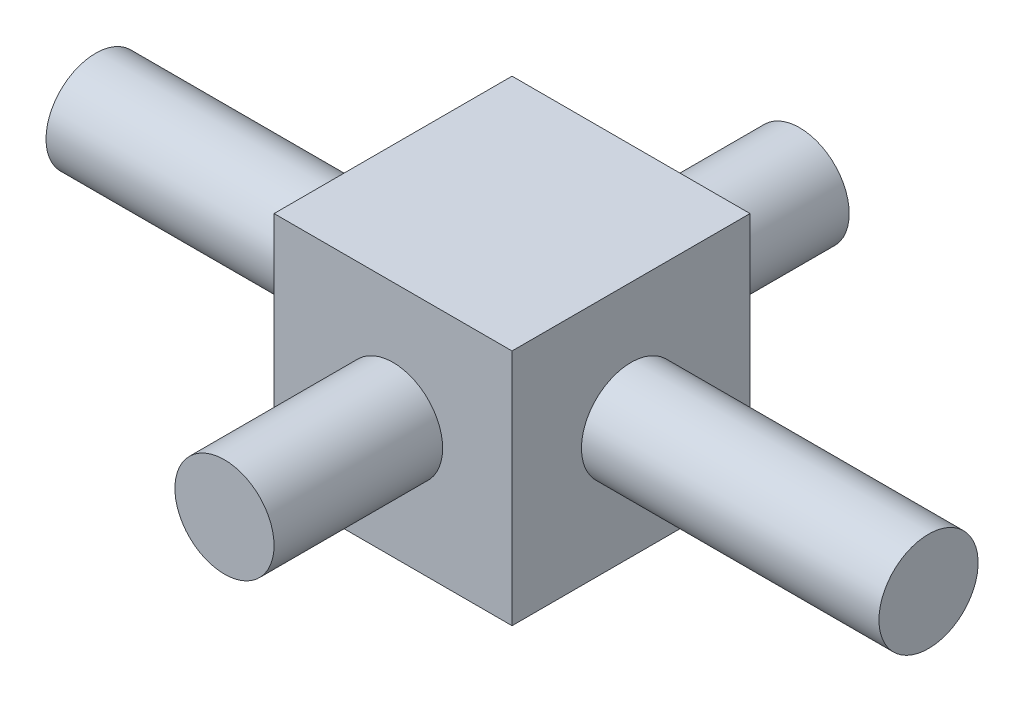
ISO-10303-21;
HEADER;
FILE_DESCRIPTION(('STEP AP214'),'2;1');
FILE_NAME('part.step','',(''),(''),'','','');
FILE_SCHEMA(('AUTOMOTIVE_DESIGN { 1 0 10303 214 1 1 1 1 }'));
ENDSEC;
DATA;
#1=APPLICATION_CONTEXT('core data for automotive mechanical design processes');
#2=APPLICATION_PROTOCOL_DEFINITION('international standard','automotive_design',2000,#1);
#3=PRODUCT_CONTEXT('',#1,'mechanical');
#4=PRODUCT('Part','Part','',(#3));
#5=PRODUCT_RELATED_PRODUCT_CATEGORY('part','',(#4));
#6=PRODUCT_DEFINITION_FORMATION('','',#4);
#7=PRODUCT_DEFINITION_CONTEXT('part definition',#1,'design');
#8=PRODUCT_DEFINITION('design','',#6,#7);
#9=PRODUCT_DEFINITION_SHAPE('','',#8);
#10=(LENGTH_UNIT() NAMED_UNIT(*) SI_UNIT(.MILLI.,.METRE.));
#11=(NAMED_UNIT(*) PLANE_ANGLE_UNIT() SI_UNIT($,.RADIAN.));
#12=(NAMED_UNIT(*) SI_UNIT($,.STERADIAN.) SOLID_ANGLE_UNIT());
#13=UNCERTAINTY_MEASURE_WITH_UNIT(LENGTH_MEASURE(1.E-05),#10,'distance_accuracy_value','');
#14=(GEOMETRIC_REPRESENTATION_CONTEXT(3) GLOBAL_UNCERTAINTY_ASSIGNED_CONTEXT((#13)) GLOBAL_UNIT_ASSIGNED_CONTEXT((#10,
#11,#12)) REPRESENTATION_CONTEXT('',''));
#15=CARTESIAN_POINT('',(0.,0.,0.));
#16=DIRECTION('',(0.,0.,1.));
#17=DIRECTION('',(1.,0.,0.));
#18=AXIS2_PLACEMENT_3D('',#15,#16,#17);
#19=CARTESIAN_POINT('',(-6.,6.,6.));
#20=DIRECTION('',(1.,0.,0.));
#21=DIRECTION('',(0.,0.,-1.));
#22=AXIS2_PLACEMENT_3D('',#19,#20,#21);
#23=PLANE('',#22);
#24=CARTESIAN_POINT('',(-6.,0.,0.));
#25=DIRECTION('',(1.,0.,0.));
#26=DIRECTION('',(0.,0.,-1.));
#27=AXIS2_PLACEMENT_3D('',#24,#25,#26);
#28=CIRCLE('',#27,2.5);
#29=CARTESIAN_POINT('',(-6.,0.,-2.5));
#30=VERTEX_POINT('',#29);
#31=EDGE_CURVE('E41',#30,#30,#28,.F.);
#32=ORIENTED_EDGE('',*,*,#31,.F.);
#33=EDGE_LOOP('',(#32));
#34=FACE_BOUND('',#33,.T.);
#35=DIRECTION('',(0.,-1.,0.));
#36=VECTOR('',#35,1.);
#37=CARTESIAN_POINT('',(-6.,6.,-6.));
#38=LINE('',#37,#36);
#39=CARTESIAN_POINT('',(-6.,6.,-6.));
#40=VERTEX_POINT('',#39);
#41=CARTESIAN_POINT('',(-6.,-6.,-6.));
#42=VERTEX_POINT('',#41);
#43=EDGE_CURVE('E100',#40,#42,#38,.T.);
#44=ORIENTED_EDGE('',*,*,#43,.T.);
#45=DIRECTION('',(0.,0.,-1.));
#46=VECTOR('',#45,1.);
#47=CARTESIAN_POINT('',(-6.,-6.,6.));
#48=LINE('',#47,#46);
#49=CARTESIAN_POINT('',(-6.,-6.,6.));
#50=VERTEX_POINT('',#49);
#51=EDGE_CURVE('E91',#50,#42,#48,.T.);
#52=ORIENTED_EDGE('',*,*,#51,.F.);
#53=DIRECTION('',(0.,-1.,0.));
#54=VECTOR('',#53,1.);
#55=CARTESIAN_POINT('',(-6.,6.,6.));
#56=LINE('',#55,#54);
#57=CARTESIAN_POINT('',(-6.,6.,6.));
#58=VERTEX_POINT('',#57);
#59=EDGE_CURVE('E85',#58,#50,#56,.T.);
#60=ORIENTED_EDGE('',*,*,#59,.F.);
#61=DIRECTION('',(0.,0.,-1.));
#62=VECTOR('',#61,1.);
#63=CARTESIAN_POINT('',(-6.,6.,6.));
#64=LINE('',#63,#62);
#65=EDGE_CURVE('E96',#58,#40,#64,.T.);
#66=ORIENTED_EDGE('',*,*,#65,.T.);
#67=EDGE_LOOP('',(#44,#52,#60,#66));
#68=FACE_BOUND('',#67,.T.);
#69=ADVANCED_FACE('F33',(#34,#68),#23,.F.);
#70=CARTESIAN_POINT('',(-6.,-6.,6.));
#71=DIRECTION('',(0.,1.,0.));
#72=DIRECTION('',(0.,0.,1.));
#73=AXIS2_PLACEMENT_3D('',#70,#71,#72);
#74=PLANE('',#73);
#75=DIRECTION('',(1.,0.,0.));
#76=VECTOR('',#75,1.);
#77=CARTESIAN_POINT('',(-6.,-6.,-6.));
#78=LINE('',#77,#76);
#79=CARTESIAN_POINT('',(6.,-6.,-6.));
#80=VERTEX_POINT('',#79);
#81=EDGE_CURVE('E90',#42,#80,#78,.T.);
#82=ORIENTED_EDGE('',*,*,#81,.T.);
#83=DIRECTION('',(0.,0.,-1.));
#84=VECTOR('',#83,1.);
#85=CARTESIAN_POINT('',(6.,-6.,6.));
#86=LINE('',#85,#84);
#87=CARTESIAN_POINT('',(6.,-6.,6.));
#88=VERTEX_POINT('',#87);
#89=EDGE_CURVE('E88',#88,#80,#86,.T.);
#90=ORIENTED_EDGE('',*,*,#89,.F.);
#91=DIRECTION('',(1.,0.,0.));
#92=VECTOR('',#91,1.);
#93=CARTESIAN_POINT('',(-6.,-6.,6.));
#94=LINE('',#93,#92);
#95=EDGE_CURVE('E80',#50,#88,#94,.T.);
#96=ORIENTED_EDGE('',*,*,#95,.F.);
#97=ORIENTED_EDGE('',*,*,#51,.T.);
#98=EDGE_LOOP('',(#82,#90,#96,#97));
#99=FACE_BOUND('',#98,.T.);
#100=ADVANCED_FACE('F89',(#99),#74,.F.);
#101=CARTESIAN_POINT('',(6.,-6.,6.));
#102=DIRECTION('',(-1.,0.,0.));
#103=DIRECTION('',(0.,0.,1.));
#104=AXIS2_PLACEMENT_3D('',#101,#102,#103);
#105=PLANE('',#104);
#106=CARTESIAN_POINT('',(6.,0.,0.));
#107=DIRECTION('',(-1.,0.,0.));
#108=DIRECTION('',(0.,0.,1.));
#109=AXIS2_PLACEMENT_3D('',#106,#107,#108);
#110=CIRCLE('',#109,2.5);
#111=CARTESIAN_POINT('',(6.,0.,2.5));
#112=VERTEX_POINT('',#111);
#113=EDGE_CURVE('E109',#112,#112,#110,.F.);
#114=ORIENTED_EDGE('',*,*,#113,.F.);
#115=EDGE_LOOP('',(#114));
#116=FACE_BOUND('',#115,.T.);
#117=DIRECTION('',(0.,1.,0.));
#118=VECTOR('',#117,1.);
#119=CARTESIAN_POINT('',(6.,-6.,-6.));
#120=LINE('',#119,#118);
#121=CARTESIAN_POINT('',(6.,6.,-6.));
#122=VERTEX_POINT('',#121);
#123=EDGE_CURVE('E66',#80,#122,#120,.T.);
#124=ORIENTED_EDGE('',*,*,#123,.T.);
#125=DIRECTION('',(0.,0.,-1.));
#126=VECTOR('',#125,1.);
#127=CARTESIAN_POINT('',(6.,6.,6.));
#128=LINE('',#127,#126);
#129=CARTESIAN_POINT('',(6.,6.,6.));
#130=VERTEX_POINT('',#129);
#131=EDGE_CURVE('E92',#130,#122,#128,.T.);
#132=ORIENTED_EDGE('',*,*,#131,.F.);
#133=DIRECTION('',(0.,1.,0.));
#134=VECTOR('',#133,1.);
#135=CARTESIAN_POINT('',(6.,-6.,6.));
#136=LINE('',#135,#134);
#137=EDGE_CURVE('E83',#88,#130,#136,.T.);
#138=ORIENTED_EDGE('',*,*,#137,.F.);
#139=ORIENTED_EDGE('',*,*,#89,.T.);
#140=EDGE_LOOP('',(#124,#132,#138,#139));
#141=FACE_BOUND('',#140,.T.);
#142=ADVANCED_FACE('F94',(#116,#141),#105,.F.);
#143=CARTESIAN_POINT('',(6.,6.,6.));
#144=DIRECTION('',(0.,-1.,0.));
#145=DIRECTION('',(0.,0.,-1.));
#146=AXIS2_PLACEMENT_3D('',#143,#144,#145);
#147=PLANE('',#146);
#148=DIRECTION('',(-1.,0.,0.));
#149=VECTOR('',#148,1.);
#150=CARTESIAN_POINT('',(6.,6.,-6.));
#151=LINE('',#150,#149);
#152=EDGE_CURVE('E72',#122,#40,#151,.T.);
#153=ORIENTED_EDGE('',*,*,#152,.T.);
#154=ORIENTED_EDGE('',*,*,#65,.F.);
#155=DIRECTION('',(-1.,0.,0.));
#156=VECTOR('',#155,1.);
#157=CARTESIAN_POINT('',(6.,6.,6.));
#158=LINE('',#157,#156);
#159=EDGE_CURVE('E49',#130,#58,#158,.T.);
#160=ORIENTED_EDGE('',*,*,#159,.F.);
#161=ORIENTED_EDGE('',*,*,#131,.T.);
#162=EDGE_LOOP('',(#153,#154,#160,#161));
#163=FACE_BOUND('',#162,.T.);
#164=ADVANCED_FACE('F170',(#163),#147,.F.);
#165=CARTESIAN_POINT('',(0.,0.,6.));
#166=DIRECTION('',(0.,0.,1.));
#167=DIRECTION('',(1.,0.,0.));
#168=AXIS2_PLACEMENT_3D('',#165,#166,#167);
#169=PLANE('',#168);
#170=CARTESIAN_POINT('',(0.,0.,6.));
#171=DIRECTION('',(0.,0.,1.));
#172=DIRECTION('',(1.,0.,0.));
#173=AXIS2_PLACEMENT_3D('',#170,#171,#172);
#174=CIRCLE('',#173,2.5);
#175=CARTESIAN_POINT('',(2.5,0.,6.));
#176=VERTEX_POINT('',#175);
#177=EDGE_CURVE('E123',#176,#176,#174,.F.);
#178=ORIENTED_EDGE('',*,*,#177,.T.);
#179=EDGE_LOOP('',(#178));
#180=FACE_BOUND('',#179,.T.);
#181=ORIENTED_EDGE('',*,*,#59,.T.);
#182=ORIENTED_EDGE('',*,*,#95,.T.);
#183=ORIENTED_EDGE('',*,*,#137,.T.);
#184=ORIENTED_EDGE('',*,*,#159,.T.);
#185=EDGE_LOOP('',(#181,#182,#183,#184));
#186=FACE_BOUND('',#185,.T.);
#187=ADVANCED_FACE('F81',(#180,#186),#169,.T.);
#188=CARTESIAN_POINT('',(0.,0.,-6.));
#189=DIRECTION('',(0.,0.,1.));
#190=DIRECTION('',(1.,0.,0.));
#191=AXIS2_PLACEMENT_3D('',#188,#189,#190);
#192=PLANE('',#191);
#193=CARTESIAN_POINT('',(0.,0.,-6.));
#194=DIRECTION('',(0.,0.,1.));
#195=DIRECTION('',(1.,0.,0.));
#196=AXIS2_PLACEMENT_3D('',#193,#194,#195);
#197=CIRCLE('',#196,2.5);
#198=CARTESIAN_POINT('',(2.5,0.,-6.));
#199=VERTEX_POINT('',#198);
#200=EDGE_CURVE('E11',#199,#199,#197,.F.);
#201=ORIENTED_EDGE('',*,*,#200,.F.);
#202=EDGE_LOOP('',(#201));
#203=FACE_BOUND('',#202,.T.);
#204=ORIENTED_EDGE('',*,*,#43,.F.);
#205=ORIENTED_EDGE('',*,*,#152,.F.);
#206=ORIENTED_EDGE('',*,*,#123,.F.);
#207=ORIENTED_EDGE('',*,*,#81,.F.);
#208=EDGE_LOOP('',(#204,#205,#206,#207));
#209=FACE_BOUND('',#208,.T.);
#210=ADVANCED_FACE('F158',(#203,#209),#192,.F.);
#211=CARTESIAN_POINT('',(21.,2.5,0.));
#212=DIRECTION('',(-1.,0.,0.));
#213=DIRECTION('',(0.,0.,1.));
#214=AXIS2_PLACEMENT_3D('',#211,#212,#213);
#215=PLANE('',#214);
#216=CARTESIAN_POINT('',(21.,0.,0.));
#217=DIRECTION('',(-1.,0.,0.));
#218=DIRECTION('',(0.,0.,1.));
#219=AXIS2_PLACEMENT_3D('',#216,#217,#218);
#220=CIRCLE('',#219,2.5);
#221=CARTESIAN_POINT('',(21.,0.,2.5));
#222=VERTEX_POINT('',#221);
#223=EDGE_CURVE('E120',#222,#222,#220,.T.);
#224=ORIENTED_EDGE('',*,*,#223,.F.);
#225=EDGE_LOOP('',(#224));
#226=FACE_BOUND('',#225,.T.);
#227=ADVANCED_FACE('F160',(#226),#215,.F.);
#228=CARTESIAN_POINT('',(-25.,0.,0.));
#229=DIRECTION('',(-1.,0.,0.));
#230=DIRECTION('',(0.,0.,1.));
#231=AXIS2_PLACEMENT_3D('',#228,#229,#230);
#232=CYLINDRICAL_SURFACE('',#231,2.5);
#233=ORIENTED_EDGE('',*,*,#223,.T.);
#234=EDGE_LOOP('',(#233));
#235=FACE_BOUND('',#234,.T.);
#236=ORIENTED_EDGE('',*,*,#113,.T.);
#237=EDGE_LOOP('',(#236));
#238=FACE_BOUND('',#237,.T.);
#239=ADVANCED_FACE('F167',(#235,#238),#232,.T.);
#240=CARTESIAN_POINT('',(-21.,0.,0.));
#241=DIRECTION('',(-1.,0.,0.));
#242=DIRECTION('',(0.,0.,1.));
#243=AXIS2_PLACEMENT_3D('',#240,#241,#242);
#244=CIRCLE('',#243,2.5);
#245=CARTESIAN_POINT('',(-21.,0.,2.5));
#246=VERTEX_POINT('',#245);
#247=EDGE_CURVE('E103',#246,#246,#244,.T.);
#248=ORIENTED_EDGE('',*,*,#247,.F.);
#249=EDGE_LOOP('',(#248));
#250=FACE_BOUND('',#249,.T.);
#251=ORIENTED_EDGE('',*,*,#31,.T.);
#252=EDGE_LOOP('',(#251));
#253=FACE_BOUND('',#252,.T.);
#254=ADVANCED_FACE('F147',(#250,#253),#232,.T.);
#255=CARTESIAN_POINT('',(-21.,0.,0.));
#256=DIRECTION('',(1.,0.,0.));
#257=DIRECTION('',(0.,0.,-1.));
#258=AXIS2_PLACEMENT_3D('',#255,#256,#257);
#259=PLANE('',#258);
#260=ORIENTED_EDGE('',*,*,#247,.T.);
#261=EDGE_LOOP('',(#260));
#262=FACE_BOUND('',#261,.T.);
#263=ADVANCED_FACE('F138',(#262),#259,.F.);
#264=CARTESIAN_POINT('',(0.,2.5,-14.5));
#265=DIRECTION('',(0.,0.,1.));
#266=DIRECTION('',(1.,0.,0.));
#267=AXIS2_PLACEMENT_3D('',#264,#265,#266);
#268=PLANE('',#267);
#269=CARTESIAN_POINT('',(0.,0.,-14.5));
#270=DIRECTION('',(0.,0.,1.));
#271=DIRECTION('',(1.,0.,0.));
#272=AXIS2_PLACEMENT_3D('',#269,#270,#271);
#273=CIRCLE('',#272,2.5);
#274=CARTESIAN_POINT('',(2.5,0.,-14.5));
#275=VERTEX_POINT('',#274);
#276=EDGE_CURVE('E129',#275,#275,#273,.T.);
#277=ORIENTED_EDGE('',*,*,#276,.F.);
#278=EDGE_LOOP('',(#277));
#279=FACE_BOUND('',#278,.T.);
#280=ADVANCED_FACE('F136',(#279),#268,.F.);
#281=CARTESIAN_POINT('',(0.,0.,18.5));
#282=DIRECTION('',(0.,0.,1.));
#283=DIRECTION('',(1.,0.,0.));
#284=AXIS2_PLACEMENT_3D('',#281,#282,#283);
#285=CYLINDRICAL_SURFACE('',#284,2.5);
#286=ORIENTED_EDGE('',*,*,#276,.T.);
#287=EDGE_LOOP('',(#286));
#288=FACE_BOUND('',#287,.T.);
#289=ORIENTED_EDGE('',*,*,#200,.T.);
#290=EDGE_LOOP('',(#289));
#291=FACE_BOUND('',#290,.T.);
#292=ADVANCED_FACE('F133',(#288,#291),#285,.T.);
#293=CARTESIAN_POINT('',(0.,0.,14.5));
#294=DIRECTION('',(0.,0.,-1.));
#295=DIRECTION('',(-1.,0.,0.));
#296=AXIS2_PLACEMENT_3D('',#293,#294,#295);
#297=PLANE('',#296);
#298=CARTESIAN_POINT('',(0.,0.,14.5));
#299=DIRECTION('',(0.,0.,1.));
#300=DIRECTION('',(1.,0.,0.));
#301=AXIS2_PLACEMENT_3D('',#298,#299,#300);
#302=CIRCLE('',#301,2.5);
#303=CARTESIAN_POINT('',(2.5,0.,14.5));
#304=VERTEX_POINT('',#303);
#305=EDGE_CURVE('E126',#304,#304,#302,.T.);
#306=ORIENTED_EDGE('',*,*,#305,.T.);
#307=EDGE_LOOP('',(#306));
#308=FACE_BOUND('',#307,.T.);
#309=ADVANCED_FACE('F144',(#308),#297,.F.);
#310=ORIENTED_EDGE('',*,*,#177,.F.);
#311=EDGE_LOOP('',(#310));
#312=FACE_BOUND('',#311,.T.);
#313=ORIENTED_EDGE('',*,*,#305,.F.);
#314=EDGE_LOOP('',(#313));
#315=FACE_BOUND('',#314,.T.);
#316=ADVANCED_FACE('F146',(#312,#315),#285,.T.);
#317=CLOSED_SHELL('',(#69,#100,#142,#164,#187,#210,#227,#239,#254,#263,#280,#292,#309,#316));
#318=MANIFOLD_SOLID_BREP('B2',#317);
#319=ADVANCED_BREP_SHAPE_REPRESENTATION('',(#18,#318),#14);
#320=SHAPE_DEFINITION_REPRESENTATION(#9,#319);
ENDSEC;
END-ISO-10303-21;
